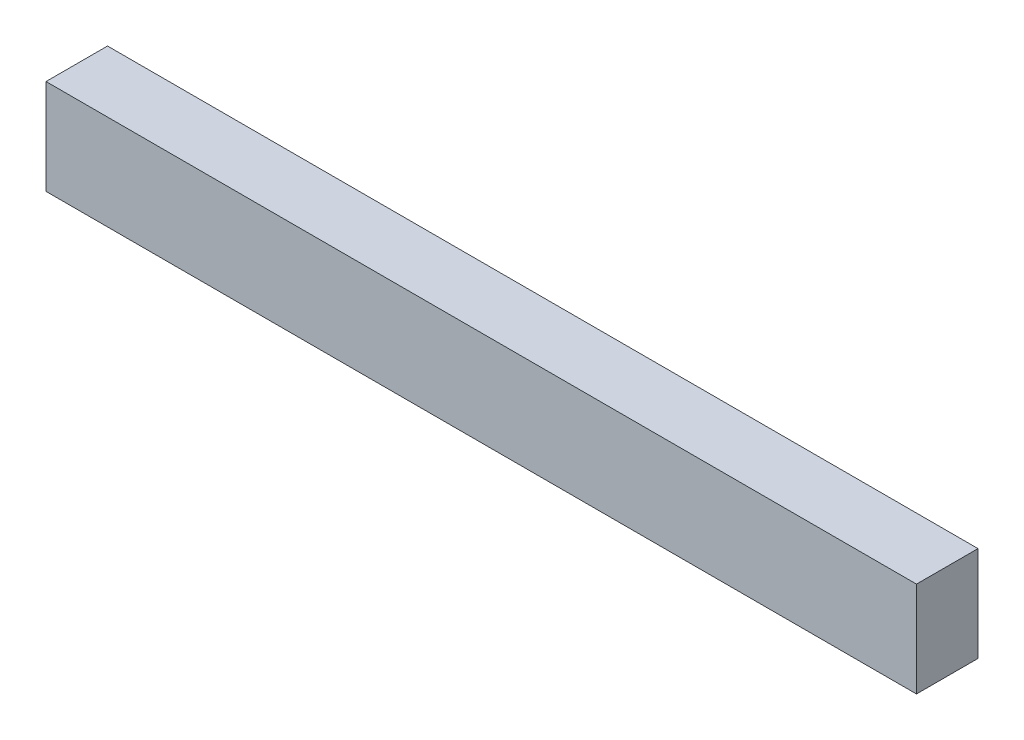
ISO-10303-21;
HEADER;
FILE_DESCRIPTION(('STEP AP214'),'2;1');
FILE_NAME('part.step','',(''),(''),'','','');
FILE_SCHEMA(('AUTOMOTIVE_DESIGN { 1 0 10303 214 1 1 1 1 }'));
ENDSEC;
DATA;
#1=APPLICATION_CONTEXT('core data for automotive mechanical design processes');
#2=APPLICATION_PROTOCOL_DEFINITION('international standard','automotive_design',2000,#1);
#3=PRODUCT_CONTEXT('',#1,'mechanical');
#4=PRODUCT('Part','Part','',(#3));
#5=PRODUCT_RELATED_PRODUCT_CATEGORY('part','',(#4));
#6=PRODUCT_DEFINITION_FORMATION('','',#4);
#7=PRODUCT_DEFINITION_CONTEXT('part definition',#1,'design');
#8=PRODUCT_DEFINITION('design','',#6,#7);
#9=PRODUCT_DEFINITION_SHAPE('','',#8);
#10=(LENGTH_UNIT() NAMED_UNIT(*) SI_UNIT(.MILLI.,.METRE.));
#11=(NAMED_UNIT(*) PLANE_ANGLE_UNIT() SI_UNIT($,.RADIAN.));
#12=(NAMED_UNIT(*) SI_UNIT($,.STERADIAN.) SOLID_ANGLE_UNIT());
#13=UNCERTAINTY_MEASURE_WITH_UNIT(LENGTH_MEASURE(1.E-05),#10,'distance_accuracy_value','');
#14=(GEOMETRIC_REPRESENTATION_CONTEXT(3) GLOBAL_UNCERTAINTY_ASSIGNED_CONTEXT((#13)) GLOBAL_UNIT_ASSIGNED_CONTEXT((#10,
#11,#12)) REPRESENTATION_CONTEXT('',''));
#15=CARTESIAN_POINT('',(0.,0.,0.));
#16=DIRECTION('',(0.,0.,1.));
#17=DIRECTION('',(1.,0.,0.));
#18=AXIS2_PLACEMENT_3D('',#15,#16,#17);
#19=CARTESIAN_POINT('',(31.677290909726,8.449089114766,1.2425));
#20=DIRECTION('',(0.,0.,1.));
#21=DIRECTION('',(1.,0.,0.));
#22=AXIS2_PLACEMENT_3D('',#19,#20,#21);
#23=PLANE('',#22);
#24=DIRECTION('',(0.,1.,0.));
#25=VECTOR('',#24,1.);
#26=CARTESIAN_POINT('',(32.574920494297,8.449089114766,1.2425));
#27=LINE('',#26,#25);
#28=CARTESIAN_POINT('',(32.574920494297,8.859089114766,1.2425));
#29=VERTEX_POINT('',#28);
#30=CARTESIAN_POINT('',(32.574920494297,8.449089114766,1.2425));
#31=VERTEX_POINT('',#30);
#32=EDGE_CURVE('E20',#29,#31,#27,.F.);
#33=ORIENTED_EDGE('',*,*,#32,.T.);
#34=DIRECTION('',(1.,0.,0.));
#35=VECTOR('',#34,1.);
#36=CARTESIAN_POINT('',(32.574920494297,8.449089114766,1.2425));
#37=LINE('',#36,#35);
#38=CARTESIAN_POINT('',(28.824920494297,8.449089114766,1.2425));
#39=VERTEX_POINT('',#38);
#40=EDGE_CURVE('E55',#39,#31,#37,.T.);
#41=ORIENTED_EDGE('',*,*,#40,.F.);
#42=DIRECTION('',(0.,1.,0.));
#43=VECTOR('',#42,1.);
#44=CARTESIAN_POINT('',(28.824920494297,8.449089114766,1.2425));
#45=LINE('',#44,#43);
#46=CARTESIAN_POINT('',(28.824920494297,8.859089114766,1.2425));
#47=VERTEX_POINT('',#46);
#48=EDGE_CURVE('E74',#39,#47,#45,.T.);
#49=ORIENTED_EDGE('',*,*,#48,.T.);
#50=DIRECTION('',(1.,0.,0.));
#51=VECTOR('',#50,1.);
#52=CARTESIAN_POINT('',(32.574920494297,8.859089114766,1.2425));
#53=LINE('',#52,#51);
#54=EDGE_CURVE('E66',#47,#29,#53,.T.);
#55=ORIENTED_EDGE('',*,*,#54,.T.);
#56=EDGE_LOOP('',(#33,#41,#49,#55));
#57=FACE_BOUND('',#56,.T.);
#58=ADVANCED_FACE('F17',(#57),#23,.F.);
#59=CARTESIAN_POINT('',(32.574920494297,8.449089114766,1.375));
#60=DIRECTION('',(-1.,0.,0.));
#61=DIRECTION('',(0.,0.,1.));
#62=AXIS2_PLACEMENT_3D('',#59,#60,#61);
#63=PLANE('',#62);
#64=DIRECTION('',(0.,1.,0.));
#65=VECTOR('',#64,1.);
#66=CARTESIAN_POINT('',(32.574920494297,8.449089114766,1.5075));
#67=LINE('',#66,#65);
#68=CARTESIAN_POINT('',(32.574920494297,8.859089114766,1.5075));
#69=VERTEX_POINT('',#68);
#70=CARTESIAN_POINT('',(32.574920494297,8.449089114766,1.5075));
#71=VERTEX_POINT('',#70);
#72=EDGE_CURVE('E72',#69,#71,#67,.F.);
#73=ORIENTED_EDGE('',*,*,#72,.T.);
#74=DIRECTION('',(0.,0.,-1.));
#75=VECTOR('',#74,1.);
#76=CARTESIAN_POINT('',(32.574920494297,8.449089114766,1.323992423363));
#77=LINE('',#76,#75);
#78=EDGE_CURVE('E62',#31,#71,#77,.F.);
#79=ORIENTED_EDGE('',*,*,#78,.F.);
#80=ORIENTED_EDGE('',*,*,#32,.F.);
#81=DIRECTION('',(0.,0.,-1.));
#82=VECTOR('',#81,1.);
#83=CARTESIAN_POINT('',(32.574920494297,8.859089114766,1.323992423363));
#84=LINE('',#83,#82);
#85=EDGE_CURVE('E78',#29,#69,#84,.F.);
#86=ORIENTED_EDGE('',*,*,#85,.T.);
#87=EDGE_LOOP('',(#73,#79,#80,#86));
#88=FACE_BOUND('',#87,.T.);
#89=ADVANCED_FACE('F71',(#88),#63,.F.);
#90=CARTESIAN_POINT('',(32.574920494297,8.449089114766,1.323992423363));
#91=DIRECTION('',(0.,-1.,0.));
#92=DIRECTION('',(0.,0.,-1.));
#93=AXIS2_PLACEMENT_3D('',#90,#91,#92);
#94=PLANE('',#93);
#95=DIRECTION('',(-1.,0.,0.));
#96=VECTOR('',#95,1.);
#97=CARTESIAN_POINT('',(30.699920494297,8.449089114766,1.5075));
#98=LINE('',#97,#96);
#99=CARTESIAN_POINT('',(28.824920494297,8.449089114766,1.5075));
#100=VERTEX_POINT('',#99);
#101=EDGE_CURVE('E83',#71,#100,#98,.T.);
#102=ORIENTED_EDGE('',*,*,#101,.T.);
#103=DIRECTION('',(0.,0.,-1.));
#104=VECTOR('',#103,1.);
#105=CARTESIAN_POINT('',(28.824920494297,8.449089114766,1.375));
#106=LINE('',#105,#104);
#107=EDGE_CURVE('E64',#100,#39,#106,.T.);
#108=ORIENTED_EDGE('',*,*,#107,.T.);
#109=ORIENTED_EDGE('',*,*,#40,.T.);
#110=ORIENTED_EDGE('',*,*,#78,.T.);
#111=EDGE_LOOP('',(#102,#108,#109,#110));
#112=FACE_BOUND('',#111,.T.);
#113=ADVANCED_FACE('F60',(#112),#94,.T.);
#114=CARTESIAN_POINT('',(28.824920494297,8.449089114766,1.375));
#115=DIRECTION('',(1.,0.,0.));
#116=DIRECTION('',(0.,0.,-1.));
#117=AXIS2_PLACEMENT_3D('',#114,#115,#116);
#118=PLANE('',#117);
#119=ORIENTED_EDGE('',*,*,#48,.F.);
#120=ORIENTED_EDGE('',*,*,#107,.F.);
#121=DIRECTION('',(0.,1.,0.));
#122=VECTOR('',#121,1.);
#123=CARTESIAN_POINT('',(28.824920494297,8.449089114766,1.5075));
#124=LINE('',#123,#122);
#125=CARTESIAN_POINT('',(28.824920494297,8.859089114766,1.5075));
#126=VERTEX_POINT('',#125);
#127=EDGE_CURVE('E26',#100,#126,#124,.T.);
#128=ORIENTED_EDGE('',*,*,#127,.T.);
#129=DIRECTION('',(0.,0.,-1.));
#130=VECTOR('',#129,1.);
#131=CARTESIAN_POINT('',(28.824920494297,8.859089114766,1.323992423363));
#132=LINE('',#131,#130);
#133=EDGE_CURVE('E34',#126,#47,#132,.T.);
#134=ORIENTED_EDGE('',*,*,#133,.T.);
#135=EDGE_LOOP('',(#119,#120,#128,#134));
#136=FACE_BOUND('',#135,.T.);
#137=ADVANCED_FACE('F88',(#136),#118,.F.);
#138=CARTESIAN_POINT('',(32.574920494297,8.859089114766,1.323992423363));
#139=DIRECTION('',(0.,-1.,0.));
#140=DIRECTION('',(0.,0.,-1.));
#141=AXIS2_PLACEMENT_3D('',#138,#139,#140);
#142=PLANE('',#141);
#143=ORIENTED_EDGE('',*,*,#133,.F.);
#144=DIRECTION('',(-1.,0.,0.));
#145=VECTOR('',#144,1.);
#146=CARTESIAN_POINT('',(30.699920494297,8.859089114766,1.5075));
#147=LINE('',#146,#145);
#148=EDGE_CURVE('E11',#126,#69,#147,.F.);
#149=ORIENTED_EDGE('',*,*,#148,.T.);
#150=ORIENTED_EDGE('',*,*,#85,.F.);
#151=ORIENTED_EDGE('',*,*,#54,.F.);
#152=EDGE_LOOP('',(#143,#149,#150,#151));
#153=FACE_BOUND('',#152,.T.);
#154=ADVANCED_FACE('F91',(#153),#142,.F.);
#155=CARTESIAN_POINT('',(30.699920494297,8.449089114766,1.5075));
#156=DIRECTION('',(0.,0.,-1.));
#157=DIRECTION('',(-1.,0.,0.));
#158=AXIS2_PLACEMENT_3D('',#155,#156,#157);
#159=PLANE('',#158);
#160=ORIENTED_EDGE('',*,*,#127,.F.);
#161=ORIENTED_EDGE('',*,*,#101,.F.);
#162=ORIENTED_EDGE('',*,*,#72,.F.);
#163=ORIENTED_EDGE('',*,*,#148,.F.);
#164=EDGE_LOOP('',(#160,#161,#162,#163));
#165=FACE_BOUND('',#164,.T.);
#166=ADVANCED_FACE('F90',(#165),#159,.F.);
#167=CLOSED_SHELL('',(#58,#89,#113,#137,#154,#166));
#168=MANIFOLD_SOLID_BREP('B1',#167);
#169=ADVANCED_BREP_SHAPE_REPRESENTATION('',(#18,#168),#14);
#170=SHAPE_DEFINITION_REPRESENTATION(#9,#169);
ENDSEC;
END-ISO-10303-21;
